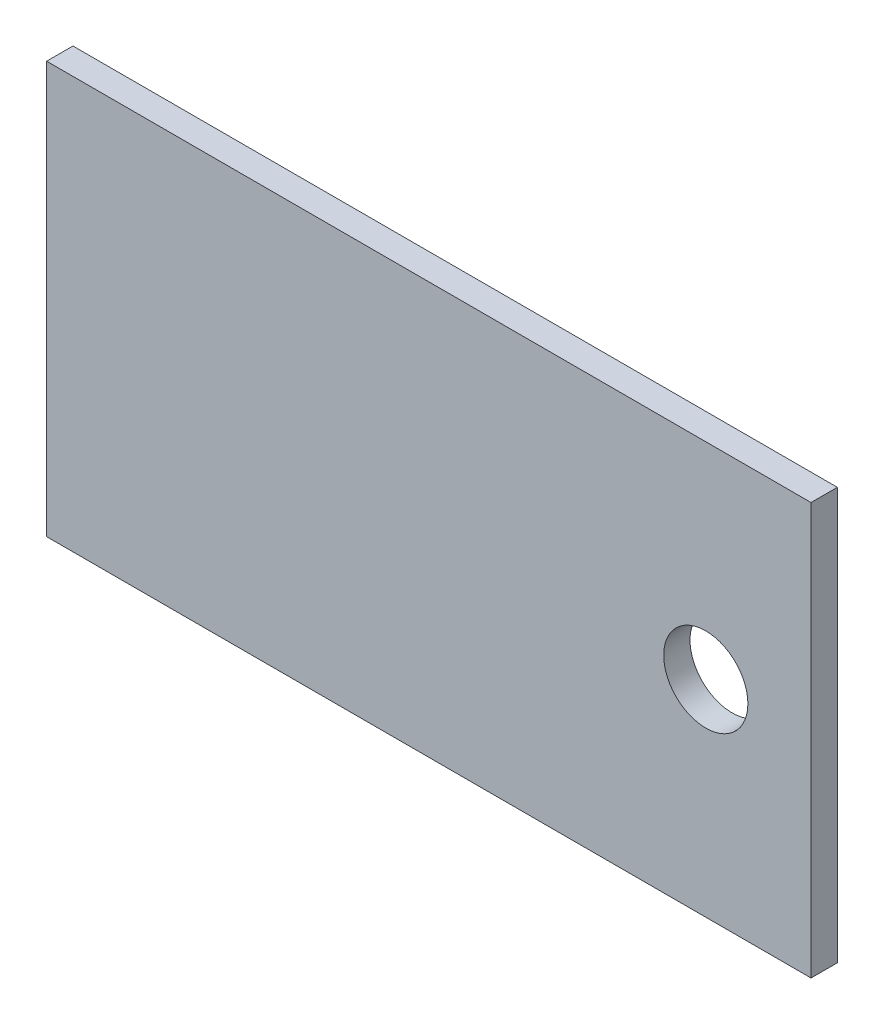
ISO-10303-21;
HEADER;
FILE_DESCRIPTION(('STEP AP214'),'2;1');
FILE_NAME('part.step','',(''),(''),'','','');
FILE_SCHEMA(('AUTOMOTIVE_DESIGN { 1 0 10303 214 1 1 1 1 }'));
ENDSEC;
DATA;
#1=APPLICATION_CONTEXT('core data for automotive mechanical design processes');
#2=APPLICATION_PROTOCOL_DEFINITION('international standard','automotive_design',2000,#1);
#3=PRODUCT_CONTEXT('',#1,'mechanical');
#4=PRODUCT('Part','Part','',(#3));
#5=PRODUCT_RELATED_PRODUCT_CATEGORY('part','',(#4));
#6=PRODUCT_DEFINITION_FORMATION('','',#4);
#7=PRODUCT_DEFINITION_CONTEXT('part definition',#1,'design');
#8=PRODUCT_DEFINITION('design','',#6,#7);
#9=PRODUCT_DEFINITION_SHAPE('','',#8);
#10=(LENGTH_UNIT() NAMED_UNIT(*) SI_UNIT(.MILLI.,.METRE.));
#11=(NAMED_UNIT(*) PLANE_ANGLE_UNIT() SI_UNIT($,.RADIAN.));
#12=(NAMED_UNIT(*) SI_UNIT($,.STERADIAN.) SOLID_ANGLE_UNIT());
#13=UNCERTAINTY_MEASURE_WITH_UNIT(LENGTH_MEASURE(1.E-05),#10,'distance_accuracy_value','');
#14=(GEOMETRIC_REPRESENTATION_CONTEXT(3) GLOBAL_UNCERTAINTY_ASSIGNED_CONTEXT((#13)) GLOBAL_UNIT_ASSIGNED_CONTEXT((#10,
#11,#12)) REPRESENTATION_CONTEXT('',''));
#15=CARTESIAN_POINT('',(0.,0.,0.));
#16=DIRECTION('',(0.,0.,1.));
#17=DIRECTION('',(1.,0.,0.));
#18=AXIS2_PLACEMENT_3D('',#15,#16,#17);
#19=CARTESIAN_POINT('',(58.1,0.,2.));
#20=DIRECTION('',(0.,1.,0.));
#21=DIRECTION('',(0.,0.,1.));
#22=AXIS2_PLACEMENT_3D('',#19,#20,#21);
#23=PLANE('',#22);
#24=DIRECTION('',(1.,0.,0.));
#25=VECTOR('',#24,1.);
#26=CARTESIAN_POINT('',(58.1,0.,0.));
#27=LINE('',#26,#25);
#28=CARTESIAN_POINT('',(0.,0.,0.));
#29=VERTEX_POINT('',#28);
#30=CARTESIAN_POINT('',(58.1,0.,0.));
#31=VERTEX_POINT('',#30);
#32=EDGE_CURVE('E107',#29,#31,#27,.T.);
#33=ORIENTED_EDGE('',*,*,#32,.T.);
#34=DIRECTION('',(0.,0.,-1.));
#35=VECTOR('',#34,1.);
#36=CARTESIAN_POINT('',(58.1,0.,2.));
#37=LINE('',#36,#35);
#38=CARTESIAN_POINT('',(58.1,0.,2.));
#39=VERTEX_POINT('',#38);
#40=EDGE_CURVE('E11',#39,#31,#37,.T.);
#41=ORIENTED_EDGE('',*,*,#40,.F.);
#42=DIRECTION('',(1.,0.,0.));
#43=VECTOR('',#42,1.);
#44=CARTESIAN_POINT('',(58.1,0.,2.));
#45=LINE('',#44,#43);
#46=CARTESIAN_POINT('',(0.,0.,2.));
#47=VERTEX_POINT('',#46);
#48=EDGE_CURVE('E91',#47,#39,#45,.T.);
#49=ORIENTED_EDGE('',*,*,#48,.F.);
#50=DIRECTION('',(0.,0.,-1.));
#51=VECTOR('',#50,1.);
#52=CARTESIAN_POINT('',(0.,0.,2.));
#53=LINE('',#52,#51);
#54=EDGE_CURVE('E103',#47,#29,#53,.T.);
#55=ORIENTED_EDGE('',*,*,#54,.T.);
#56=EDGE_LOOP('',(#33,#41,#49,#55));
#57=FACE_BOUND('',#56,.T.);
#58=ADVANCED_FACE('F39',(#57),#23,.F.);
#59=CARTESIAN_POINT('',(58.1,31.3,2.));
#60=DIRECTION('',(-1.,0.,0.));
#61=DIRECTION('',(0.,0.,1.));
#62=AXIS2_PLACEMENT_3D('',#59,#60,#61);
#63=PLANE('',#62);
#64=DIRECTION('',(0.,1.,0.));
#65=VECTOR('',#64,1.);
#66=CARTESIAN_POINT('',(58.1,31.3,0.));
#67=LINE('',#66,#65);
#68=CARTESIAN_POINT('',(58.1,31.3,0.));
#69=VERTEX_POINT('',#68);
#70=EDGE_CURVE('E96',#31,#69,#67,.T.);
#71=ORIENTED_EDGE('',*,*,#70,.T.);
#72=DIRECTION('',(0.,0.,-1.));
#73=VECTOR('',#72,1.);
#74=CARTESIAN_POINT('',(58.1,31.3,2.));
#75=LINE('',#74,#73);
#76=CARTESIAN_POINT('',(58.1,31.3,2.));
#77=VERTEX_POINT('',#76);
#78=EDGE_CURVE('E48',#77,#69,#75,.T.);
#79=ORIENTED_EDGE('',*,*,#78,.F.);
#80=DIRECTION('',(0.,1.,0.));
#81=VECTOR('',#80,1.);
#82=CARTESIAN_POINT('',(58.1,31.3,2.));
#83=LINE('',#82,#81);
#84=EDGE_CURVE('E86',#39,#77,#83,.T.);
#85=ORIENTED_EDGE('',*,*,#84,.F.);
#86=ORIENTED_EDGE('',*,*,#40,.T.);
#87=EDGE_LOOP('',(#71,#79,#85,#86));
#88=FACE_BOUND('',#87,.T.);
#89=ADVANCED_FACE('F95',(#88),#63,.F.);
#90=CARTESIAN_POINT('',(0.,31.3,2.));
#91=DIRECTION('',(0.,-1.,0.));
#92=DIRECTION('',(0.,0.,-1.));
#93=AXIS2_PLACEMENT_3D('',#90,#91,#92);
#94=PLANE('',#93);
#95=DIRECTION('',(-1.,0.,0.));
#96=VECTOR('',#95,1.);
#97=CARTESIAN_POINT('',(0.,31.3,0.));
#98=LINE('',#97,#96);
#99=CARTESIAN_POINT('',(0.,31.3,0.));
#100=VERTEX_POINT('',#99);
#101=EDGE_CURVE('E73',#69,#100,#98,.T.);
#102=ORIENTED_EDGE('',*,*,#101,.T.);
#103=DIRECTION('',(0.,0.,-1.));
#104=VECTOR('',#103,1.);
#105=CARTESIAN_POINT('',(0.,31.3,2.));
#106=LINE('',#105,#104);
#107=CARTESIAN_POINT('',(0.,31.3,2.));
#108=VERTEX_POINT('',#107);
#109=EDGE_CURVE('E98',#108,#100,#106,.T.);
#110=ORIENTED_EDGE('',*,*,#109,.F.);
#111=DIRECTION('',(-1.,0.,0.));
#112=VECTOR('',#111,1.);
#113=CARTESIAN_POINT('',(0.,31.3,2.));
#114=LINE('',#113,#112);
#115=EDGE_CURVE('E89',#77,#108,#114,.T.);
#116=ORIENTED_EDGE('',*,*,#115,.F.);
#117=ORIENTED_EDGE('',*,*,#78,.T.);
#118=EDGE_LOOP('',(#102,#110,#116,#117));
#119=FACE_BOUND('',#118,.T.);
#120=ADVANCED_FACE('F99',(#119),#94,.F.);
#121=CARTESIAN_POINT('',(0.,0.,2.));
#122=DIRECTION('',(1.,0.,0.));
#123=DIRECTION('',(0.,0.,-1.));
#124=AXIS2_PLACEMENT_3D('',#121,#122,#123);
#125=PLANE('',#124);
#126=DIRECTION('',(0.,-1.,0.));
#127=VECTOR('',#126,1.);
#128=CARTESIAN_POINT('',(0.,0.,0.));
#129=LINE('',#128,#127);
#130=EDGE_CURVE('E79',#100,#29,#129,.T.);
#131=ORIENTED_EDGE('',*,*,#130,.T.);
#132=ORIENTED_EDGE('',*,*,#54,.F.);
#133=DIRECTION('',(0.,-1.,0.));
#134=VECTOR('',#133,1.);
#135=CARTESIAN_POINT('',(0.,0.,2.));
#136=LINE('',#135,#134);
#137=EDGE_CURVE('E56',#108,#47,#136,.T.);
#138=ORIENTED_EDGE('',*,*,#137,.F.);
#139=ORIENTED_EDGE('',*,*,#109,.T.);
#140=EDGE_LOOP('',(#131,#132,#138,#139));
#141=FACE_BOUND('',#140,.T.);
#142=ADVANCED_FACE('F121',(#141),#125,.F.);
#143=CARTESIAN_POINT('',(0.,0.,2.));
#144=DIRECTION('',(0.,0.,-1.));
#145=DIRECTION('',(-1.,0.,0.));
#146=AXIS2_PLACEMENT_3D('',#143,#144,#145);
#147=PLANE('',#146);
#148=CARTESIAN_POINT('',(50.1,15.65,2.));
#149=DIRECTION('',(0.,0.,1.));
#150=DIRECTION('',(1.,0.,0.));
#151=AXIS2_PLACEMENT_3D('',#148,#149,#150);
#152=CIRCLE('',#151,3.2);
#153=CARTESIAN_POINT('',(53.3,15.65,2.));
#154=VERTEX_POINT('',#153);
#155=EDGE_CURVE('E111',#154,#154,#152,.T.);
#156=ORIENTED_EDGE('',*,*,#155,.F.);
#157=EDGE_LOOP('',(#156));
#158=FACE_BOUND('',#157,.T.);
#159=ORIENTED_EDGE('',*,*,#48,.T.);
#160=ORIENTED_EDGE('',*,*,#84,.T.);
#161=ORIENTED_EDGE('',*,*,#115,.T.);
#162=ORIENTED_EDGE('',*,*,#137,.T.);
#163=EDGE_LOOP('',(#159,#160,#161,#162));
#164=FACE_BOUND('',#163,.T.);
#165=ADVANCED_FACE('F87',(#158,#164),#147,.F.);
#166=CARTESIAN_POINT('',(0.,0.,0.));
#167=DIRECTION('',(0.,0.,-1.));
#168=DIRECTION('',(-1.,0.,0.));
#169=AXIS2_PLACEMENT_3D('',#166,#167,#168);
#170=PLANE('',#169);
#171=CARTESIAN_POINT('',(50.1,15.65,0.));
#172=DIRECTION('',(0.,0.,1.));
#173=DIRECTION('',(1.,0.,0.));
#174=AXIS2_PLACEMENT_3D('',#171,#172,#173);
#175=CIRCLE('',#174,3.2);
#176=CARTESIAN_POINT('',(53.3,15.65,0.));
#177=VERTEX_POINT('',#176);
#178=EDGE_CURVE('E128',#177,#177,#175,.T.);
#179=ORIENTED_EDGE('',*,*,#178,.T.);
#180=EDGE_LOOP('',(#179));
#181=FACE_BOUND('',#180,.T.);
#182=ORIENTED_EDGE('',*,*,#32,.F.);
#183=ORIENTED_EDGE('',*,*,#130,.F.);
#184=ORIENTED_EDGE('',*,*,#101,.F.);
#185=ORIENTED_EDGE('',*,*,#70,.F.);
#186=EDGE_LOOP('',(#182,#183,#184,#185));
#187=FACE_BOUND('',#186,.T.);
#188=ADVANCED_FACE('F124',(#181,#187),#170,.T.);
#189=CARTESIAN_POINT('',(50.1,15.65,2.));
#190=DIRECTION('',(0.,0.,-1.));
#191=DIRECTION('',(-1.,0.,0.));
#192=AXIS2_PLACEMENT_3D('',#189,#190,#191);
#193=CYLINDRICAL_SURFACE('',#192,3.2);
#194=ORIENTED_EDGE('',*,*,#155,.T.);
#195=EDGE_LOOP('',(#194));
#196=FACE_BOUND('',#195,.T.);
#197=ORIENTED_EDGE('',*,*,#178,.F.);
#198=EDGE_LOOP('',(#197));
#199=FACE_BOUND('',#198,.T.);
#200=ADVANCED_FACE('F136',(#196,#199),#193,.F.);
#201=CLOSED_SHELL('',(#58,#89,#120,#142,#165,#188,#200));
#202=MANIFOLD_SOLID_BREP('B2',#201);
#203=ADVANCED_BREP_SHAPE_REPRESENTATION('',(#18,#202),#14);
#204=SHAPE_DEFINITION_REPRESENTATION(#9,#203);
ENDSEC;
END-ISO-10303-21;
